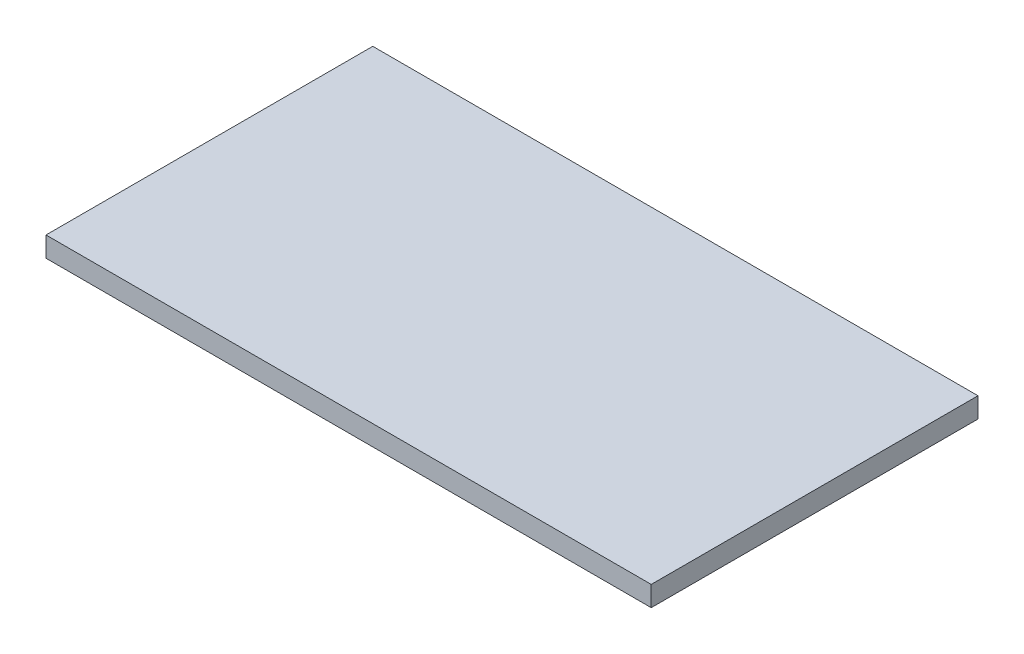
ISO-10303-21;
HEADER;
FILE_DESCRIPTION(('STEP AP214'),'2;1');
FILE_NAME('part.step','',(''),(''),'','','');
FILE_SCHEMA(('AUTOMOTIVE_DESIGN { 1 0 10303 214 1 1 1 1 }'));
ENDSEC;
DATA;
#1=APPLICATION_CONTEXT('core data for automotive mechanical design processes');
#2=APPLICATION_PROTOCOL_DEFINITION('international standard','automotive_design',2000,#1);
#3=PRODUCT_CONTEXT('',#1,'mechanical');
#4=PRODUCT('Part','Part','',(#3));
#5=PRODUCT_RELATED_PRODUCT_CATEGORY('part','',(#4));
#6=PRODUCT_DEFINITION_FORMATION('','',#4);
#7=PRODUCT_DEFINITION_CONTEXT('part definition',#1,'design');
#8=PRODUCT_DEFINITION('design','',#6,#7);
#9=PRODUCT_DEFINITION_SHAPE('','',#8);
#10=(LENGTH_UNIT() NAMED_UNIT(*) SI_UNIT(.MILLI.,.METRE.));
#11=(NAMED_UNIT(*) PLANE_ANGLE_UNIT() SI_UNIT($,.RADIAN.));
#12=(NAMED_UNIT(*) SI_UNIT($,.STERADIAN.) SOLID_ANGLE_UNIT());
#13=UNCERTAINTY_MEASURE_WITH_UNIT(LENGTH_MEASURE(1.E-05),#10,'distance_accuracy_value','');
#14=(GEOMETRIC_REPRESENTATION_CONTEXT(3) GLOBAL_UNCERTAINTY_ASSIGNED_CONTEXT((#13)) GLOBAL_UNIT_ASSIGNED_CONTEXT((#10,
#11,#12)) REPRESENTATION_CONTEXT('',''));
#15=CARTESIAN_POINT('',(0.,0.,0.));
#16=DIRECTION('',(0.,0.,1.));
#17=DIRECTION('',(1.,0.,0.));
#18=AXIS2_PLACEMENT_3D('',#15,#16,#17);
#19=CARTESIAN_POINT('',(0.,5.,-49.5480565089841));
#20=DIRECTION('',(1.,0.,0.));
#21=DIRECTION('',(0.,0.,-1.));
#22=AXIS2_PLACEMENT_3D('',#19,#20,#21);
#23=PLANE('',#22);
#24=DIRECTION('',(0.,0.,1.));
#25=VECTOR('',#24,1.);
#26=CARTESIAN_POINT('',(0.,0.,-49.5480565089841));
#27=LINE('',#26,#25);
#28=CARTESIAN_POINT('',(0.,0.,-49.5480565089841));
#29=VERTEX_POINT('',#28);
#30=CARTESIAN_POINT('',(0.,0.,31.4371140409516));
#31=VERTEX_POINT('',#30);
#32=EDGE_CURVE('E95',#29,#31,#27,.T.);
#33=ORIENTED_EDGE('',*,*,#32,.T.);
#34=DIRECTION('',(0.,-1.,0.));
#35=VECTOR('',#34,1.);
#36=CARTESIAN_POINT('',(0.,5.,31.4371140409516));
#37=LINE('',#36,#35);
#38=CARTESIAN_POINT('',(0.,5.,31.4371140409516));
#39=VERTEX_POINT('',#38);
#40=EDGE_CURVE('E11',#39,#31,#37,.T.);
#41=ORIENTED_EDGE('',*,*,#40,.F.);
#42=DIRECTION('',(0.,0.,1.));
#43=VECTOR('',#42,1.);
#44=CARTESIAN_POINT('',(0.,5.,-49.5480565089841));
#45=LINE('',#44,#43);
#46=CARTESIAN_POINT('',(0.,5.,-49.5480565089841));
#47=VERTEX_POINT('',#46);
#48=EDGE_CURVE('E83',#47,#39,#45,.T.);
#49=ORIENTED_EDGE('',*,*,#48,.F.);
#50=DIRECTION('',(0.,-1.,0.));
#51=VECTOR('',#50,1.);
#52=CARTESIAN_POINT('',(0.,5.,-49.5480565089841));
#53=LINE('',#52,#51);
#54=EDGE_CURVE('E91',#47,#29,#53,.T.);
#55=ORIENTED_EDGE('',*,*,#54,.T.);
#56=EDGE_LOOP('',(#33,#41,#49,#55));
#57=FACE_BOUND('',#56,.T.);
#58=ADVANCED_FACE('F32',(#57),#23,.F.);
#59=CARTESIAN_POINT('',(0.,5.,31.4371140409516));
#60=DIRECTION('',(0.,0.,-1.));
#61=DIRECTION('',(-1.,0.,0.));
#62=AXIS2_PLACEMENT_3D('',#59,#60,#61);
#63=PLANE('',#62);
#64=DIRECTION('',(1.,0.,0.));
#65=VECTOR('',#64,1.);
#66=CARTESIAN_POINT('',(0.,0.,31.4371140409516));
#67=LINE('',#66,#65);
#68=CARTESIAN_POINT('',(150.,0.,31.4371140409516));
#69=VERTEX_POINT('',#68);
#70=EDGE_CURVE('E87',#31,#69,#67,.T.);
#71=ORIENTED_EDGE('',*,*,#70,.T.);
#72=DIRECTION('',(0.,-1.,0.));
#73=VECTOR('',#72,1.);
#74=CARTESIAN_POINT('',(150.,5.,31.4371140409516));
#75=LINE('',#74,#73);
#76=CARTESIAN_POINT('',(150.,5.,31.4371140409516));
#77=VERTEX_POINT('',#76);
#78=EDGE_CURVE('E40',#77,#69,#75,.T.);
#79=ORIENTED_EDGE('',*,*,#78,.F.);
#80=DIRECTION('',(1.,0.,0.));
#81=VECTOR('',#80,1.);
#82=CARTESIAN_POINT('',(0.,5.,31.4371140409516));
#83=LINE('',#82,#81);
#84=EDGE_CURVE('E78',#39,#77,#83,.T.);
#85=ORIENTED_EDGE('',*,*,#84,.F.);
#86=ORIENTED_EDGE('',*,*,#40,.T.);
#87=EDGE_LOOP('',(#71,#79,#85,#86));
#88=FACE_BOUND('',#87,.T.);
#89=ADVANCED_FACE('F86',(#88),#63,.F.);
#90=CARTESIAN_POINT('',(150.,5.,-49.5480565089841));
#91=DIRECTION('',(-1.,0.,0.));
#92=DIRECTION('',(0.,0.,1.));
#93=AXIS2_PLACEMENT_3D('',#90,#91,#92);
#94=PLANE('',#93);
#95=DIRECTION('',(0.,0.,-1.));
#96=VECTOR('',#95,1.);
#97=CARTESIAN_POINT('',(150.,0.,-49.5480565089841));
#98=LINE('',#97,#96);
#99=CARTESIAN_POINT('',(150.,0.,-49.5480565089841));
#100=VERTEX_POINT('',#99);
#101=EDGE_CURVE('E65',#69,#100,#98,.T.);
#102=ORIENTED_EDGE('',*,*,#101,.T.);
#103=DIRECTION('',(0.,-1.,0.));
#104=VECTOR('',#103,1.);
#105=CARTESIAN_POINT('',(150.,5.,-49.5480565089841));
#106=LINE('',#105,#104);
#107=CARTESIAN_POINT('',(150.,5.,-49.5480565089841));
#108=VERTEX_POINT('',#107);
#109=EDGE_CURVE('E88',#108,#100,#106,.T.);
#110=ORIENTED_EDGE('',*,*,#109,.F.);
#111=DIRECTION('',(0.,0.,-1.));
#112=VECTOR('',#111,1.);
#113=CARTESIAN_POINT('',(150.,5.,-49.5480565089841));
#114=LINE('',#113,#112);
#115=EDGE_CURVE('E81',#77,#108,#114,.T.);
#116=ORIENTED_EDGE('',*,*,#115,.F.);
#117=ORIENTED_EDGE('',*,*,#78,.T.);
#118=EDGE_LOOP('',(#102,#110,#116,#117));
#119=FACE_BOUND('',#118,.T.);
#120=ADVANCED_FACE('F89',(#119),#94,.F.);
#121=CARTESIAN_POINT('',(0.,5.,-49.5480565089841));
#122=DIRECTION('',(0.,0.,1.));
#123=DIRECTION('',(1.,0.,0.));
#124=AXIS2_PLACEMENT_3D('',#121,#122,#123);
#125=PLANE('',#124);
#126=DIRECTION('',(-1.,0.,0.));
#127=VECTOR('',#126,1.);
#128=CARTESIAN_POINT('',(0.,0.,-49.5480565089841));
#129=LINE('',#128,#127);
#130=EDGE_CURVE('E71',#100,#29,#129,.T.);
#131=ORIENTED_EDGE('',*,*,#130,.T.);
#132=ORIENTED_EDGE('',*,*,#54,.F.);
#133=DIRECTION('',(-1.,0.,0.));
#134=VECTOR('',#133,1.);
#135=CARTESIAN_POINT('',(0.,5.,-49.5480565089841));
#136=LINE('',#135,#134);
#137=EDGE_CURVE('E48',#108,#47,#136,.T.);
#138=ORIENTED_EDGE('',*,*,#137,.F.);
#139=ORIENTED_EDGE('',*,*,#109,.T.);
#140=EDGE_LOOP('',(#131,#132,#138,#139));
#141=FACE_BOUND('',#140,.T.);
#142=ADVANCED_FACE('F102',(#141),#125,.F.);
#143=CARTESIAN_POINT('',(0.,5.,31.4371140409516));
#144=DIRECTION('',(0.,1.,0.));
#145=DIRECTION('',(0.,0.,1.));
#146=AXIS2_PLACEMENT_3D('',#143,#144,#145);
#147=PLANE('',#146);
#148=ORIENTED_EDGE('',*,*,#48,.T.);
#149=ORIENTED_EDGE('',*,*,#84,.T.);
#150=ORIENTED_EDGE('',*,*,#115,.T.);
#151=ORIENTED_EDGE('',*,*,#137,.T.);
#152=EDGE_LOOP('',(#148,#149,#150,#151));
#153=FACE_BOUND('',#152,.T.);
#154=ADVANCED_FACE('F79',(#153),#147,.T.);
#155=CARTESIAN_POINT('',(0.,0.,31.4371140409516));
#156=DIRECTION('',(0.,1.,0.));
#157=DIRECTION('',(0.,0.,1.));
#158=AXIS2_PLACEMENT_3D('',#155,#156,#157);
#159=PLANE('',#158);
#160=ORIENTED_EDGE('',*,*,#32,.F.);
#161=ORIENTED_EDGE('',*,*,#130,.F.);
#162=ORIENTED_EDGE('',*,*,#101,.F.);
#163=ORIENTED_EDGE('',*,*,#70,.F.);
#164=EDGE_LOOP('',(#160,#161,#162,#163));
#165=FACE_BOUND('',#164,.T.);
#166=ADVANCED_FACE('F105',(#165),#159,.F.);
#167=CLOSED_SHELL('',(#58,#89,#120,#142,#154,#166));
#168=MANIFOLD_SOLID_BREP('B2',#167);
#169=ADVANCED_BREP_SHAPE_REPRESENTATION('',(#18,#168),#14);
#170=SHAPE_DEFINITION_REPRESENTATION(#9,#169);
ENDSEC;
END-ISO-10303-21;
